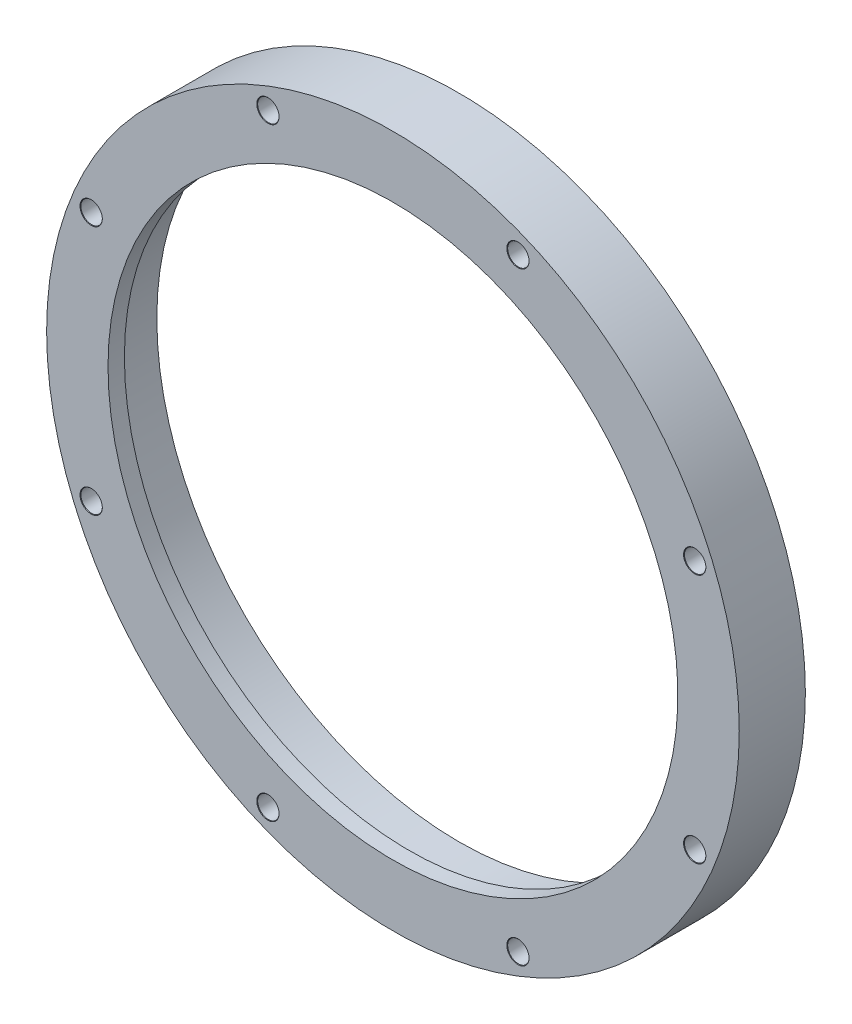
ISO-10303-21;
HEADER;
FILE_DESCRIPTION(('STEP AP214'),'2;1');
FILE_NAME('part.step','',(''),(''),'','','');
FILE_SCHEMA(('AUTOMOTIVE_DESIGN { 1 0 10303 214 1 1 1 1 }'));
ENDSEC;
DATA;
#1=APPLICATION_CONTEXT('core data for automotive mechanical design processes');
#2=APPLICATION_PROTOCOL_DEFINITION('international standard','automotive_design',2000,#1);
#3=PRODUCT_CONTEXT('',#1,'mechanical');
#4=PRODUCT('Part','Part','',(#3));
#5=PRODUCT_RELATED_PRODUCT_CATEGORY('part','',(#4));
#6=PRODUCT_DEFINITION_FORMATION('','',#4);
#7=PRODUCT_DEFINITION_CONTEXT('part definition',#1,'design');
#8=PRODUCT_DEFINITION('design','',#6,#7);
#9=PRODUCT_DEFINITION_SHAPE('','',#8);
#10=(LENGTH_UNIT() NAMED_UNIT(*) SI_UNIT(.MILLI.,.METRE.));
#11=(NAMED_UNIT(*) PLANE_ANGLE_UNIT() SI_UNIT($,.RADIAN.));
#12=(NAMED_UNIT(*) SI_UNIT($,.STERADIAN.) SOLID_ANGLE_UNIT());
#13=UNCERTAINTY_MEASURE_WITH_UNIT(LENGTH_MEASURE(1.E-05),#10,'distance_accuracy_value','');
#14=(GEOMETRIC_REPRESENTATION_CONTEXT(3) GLOBAL_UNCERTAINTY_ASSIGNED_CONTEXT((#13)) GLOBAL_UNIT_ASSIGNED_CONTEXT((#10,
#11,#12)) REPRESENTATION_CONTEXT('',''));
#15=CARTESIAN_POINT('',(0.,0.,0.));
#16=DIRECTION('',(0.,0.,1.));
#17=DIRECTION('',(1.,0.,0.));
#18=AXIS2_PLACEMENT_3D('',#15,#16,#17);
#19=CARTESIAN_POINT('',(0.,0.,70.4));
#20=DIRECTION('',(0.,0.,1.));
#21=DIRECTION('',(1.,0.,0.));
#22=AXIS2_PLACEMENT_3D('',#19,#20,#21);
#23=PLANE('',#22);
#24=CARTESIAN_POINT('',(0.,0.,70.4));
#25=DIRECTION('',(0.,0.,1.));
#26=DIRECTION('',(1.,0.,0.));
#27=AXIS2_PLACEMENT_3D('',#24,#25,#26);
#28=CIRCLE('',#27,48.);
#29=CARTESIAN_POINT('',(-48.,0.,70.4));
#30=VERTEX_POINT('',#29);
#31=EDGE_CURVE('E39',#30,#30,#28,.T.);
#32=ORIENTED_EDGE('',*,*,#31,.F.);
#33=EDGE_LOOP('',(#32));
#34=FACE_BOUND('',#33,.T.);
#35=CARTESIAN_POINT('',(0.,0.,70.4));
#36=DIRECTION('',(0.,0.,1.));
#37=DIRECTION('',(1.,0.,0.));
#38=AXIS2_PLACEMENT_3D('',#35,#36,#37);
#39=CIRCLE('',#38,45.25);
#40=CARTESIAN_POINT('',(-45.25,0.,70.4));
#41=VERTEX_POINT('',#40);
#42=EDGE_CURVE('E11',#41,#41,#39,.T.);
#43=ORIENTED_EDGE('',*,*,#42,.T.);
#44=EDGE_LOOP('',(#43));
#45=FACE_BOUND('',#44,.T.);
#46=ADVANCED_FACE('F16',(#34,#45),#23,.F.);
#47=CARTESIAN_POINT('',(19.851703053939,47.926250749023,73.0149494936612));
#48=DIRECTION('',(0.,0.,1.));
#49=DIRECTION('',(1.,0.,0.));
#50=AXIS2_PLACEMENT_3D('',#47,#48,#49);
#51=CONICAL_SURFACE('',#50,1.78505050633883,0.785398163397448);
#52=CARTESIAN_POINT('',(19.851703053939,47.926250749023,72.9298989873223));
#53=DIRECTION('',(0.,0.,-1.));
#54=DIRECTION('',(1.,0.,0.));
#55=AXIS2_PLACEMENT_3D('',#52,#53,#54);
#56=CIRCLE('',#55,1.7);
#57=CARTESIAN_POINT('',(18.151703053939,47.926250749023,72.9298989873223));
#58=VERTEX_POINT('',#57);
#59=EDGE_CURVE('E27',#58,#58,#56,.T.);
#60=ORIENTED_EDGE('',*,*,#59,.T.);
#61=DIRECTION('',(-0.707106781186547,0.,0.707106781186548));
#62=VECTOR('',#61,1.);
#63=CARTESIAN_POINT('',(18.0666525476002,47.926250749023,73.0149494936612));
#64=LINE('',#63,#62);
#65=CARTESIAN_POINT('',(18.0816020412613,47.926250749023,73.));
#66=VERTEX_POINT('',#65);
#67=EDGE_CURVE('E327',#58,#66,#64,.T.);
#68=ORIENTED_EDGE('',*,*,#67,.T.);
#69=CARTESIAN_POINT('',(19.851703053939,47.926250749023,73.));
#70=DIRECTION('',(0.,0.,-1.));
#71=DIRECTION('',(1.,0.,0.));
#72=AXIS2_PLACEMENT_3D('',#69,#70,#71);
#73=CIRCLE('',#72,1.77010101267767);
#74=CARTESIAN_POINT('',(19.1743147227746,46.2908906529326,73.));
#75=VERTEX_POINT('',#74);
#76=EDGE_CURVE('E335',#75,#66,#73,.T.);
#77=ORIENTED_EDGE('',*,*,#76,.F.);
#78=CARTESIAN_POINT('',(19.851703053939,47.926250749023,73.));
#79=DIRECTION('',(0.,0.,-1.));
#80=DIRECTION('',(1.,0.,0.));
#81=AXIS2_PLACEMENT_3D('',#78,#79,#80);
#82=CIRCLE('',#81,1.77010101267767);
#83=EDGE_CURVE('E321',#66,#75,#82,.T.);
#84=ORIENTED_EDGE('',*,*,#83,.F.);
#85=ORIENTED_EDGE('',*,*,#67,.F.);
#86=EDGE_LOOP('',(#60,#68,#77,#84,#85));
#87=FACE_BOUND('',#86,.T.);
#88=ADVANCED_FACE('F423',(#87),#51,.F.);
#89=CARTESIAN_POINT('',(-19.851703053939,47.926250749023,73.0149494936612));
#90=DIRECTION('',(0.,0.,1.));
#91=DIRECTION('',(1.,0.,0.));
#92=AXIS2_PLACEMENT_3D('',#89,#90,#91);
#93=CONICAL_SURFACE('',#92,1.78505050633883,0.785398163397448);
#94=CARTESIAN_POINT('',(-19.851703053939,47.926250749023,72.9298989873223));
#95=DIRECTION('',(0.,0.,-1.));
#96=DIRECTION('',(1.,0.,0.));
#97=AXIS2_PLACEMENT_3D('',#94,#95,#96);
#98=CIRCLE('',#97,1.7);
#99=CARTESIAN_POINT('',(-21.551703053939,47.926250749023,72.9298989873223));
#100=VERTEX_POINT('',#99);
#101=EDGE_CURVE('E231',#100,#100,#98,.T.);
#102=ORIENTED_EDGE('',*,*,#101,.T.);
#103=DIRECTION('',(-0.707106781186547,0.,0.707106781186548));
#104=VECTOR('',#103,1.);
#105=CARTESIAN_POINT('',(-21.6367535602778,47.926250749023,73.0149494936612));
#106=LINE('',#105,#104);
#107=CARTESIAN_POINT('',(-21.6218040666167,47.926250749023,73.));
#108=VERTEX_POINT('',#107);
#109=EDGE_CURVE('E227',#100,#108,#106,.T.);
#110=ORIENTED_EDGE('',*,*,#109,.T.);
#111=CARTESIAN_POINT('',(-19.851703053939,47.926250749023,73.));
#112=DIRECTION('',(0.,0.,-1.));
#113=DIRECTION('',(1.,0.,0.));
#114=AXIS2_PLACEMENT_3D('',#111,#112,#113);
#115=CIRCLE('',#114,1.77010101267767);
#116=CARTESIAN_POINT('',(-19.1743147227746,46.2908906529326,73.));
#117=VERTEX_POINT('',#116);
#118=EDGE_CURVE('E220',#117,#108,#115,.T.);
#119=ORIENTED_EDGE('',*,*,#118,.F.);
#120=CARTESIAN_POINT('',(-19.851703053939,47.926250749023,73.));
#121=DIRECTION('',(0.,0.,-1.));
#122=DIRECTION('',(1.,0.,0.));
#123=AXIS2_PLACEMENT_3D('',#120,#121,#122);
#124=CIRCLE('',#123,1.77010101267767);
#125=EDGE_CURVE('E216',#108,#117,#124,.T.);
#126=ORIENTED_EDGE('',*,*,#125,.F.);
#127=ORIENTED_EDGE('',*,*,#109,.F.);
#128=EDGE_LOOP('',(#102,#110,#119,#126,#127));
#129=FACE_BOUND('',#128,.T.);
#130=ADVANCED_FACE('F430',(#129),#93,.F.);
#131=CARTESIAN_POINT('',(-47.926250749023,19.851703053939,73.0149494936612));
#132=DIRECTION('',(0.,0.,1.));
#133=DIRECTION('',(1.,0.,0.));
#134=AXIS2_PLACEMENT_3D('',#131,#132,#133);
#135=CONICAL_SURFACE('',#134,1.78505050633883,0.785398163397448);
#136=CARTESIAN_POINT('',(-47.926250749023,19.851703053939,72.9298989873223));
#137=DIRECTION('',(0.,0.,-1.));
#138=DIRECTION('',(1.,0.,0.));
#139=AXIS2_PLACEMENT_3D('',#136,#137,#138);
#140=CIRCLE('',#139,1.7);
#141=CARTESIAN_POINT('',(-49.626250749023,19.851703053939,72.9298989873223));
#142=VERTEX_POINT('',#141);
#143=EDGE_CURVE('E232',#142,#142,#140,.T.);
#144=ORIENTED_EDGE('',*,*,#143,.T.);
#145=DIRECTION('',(-0.707106781186547,0.,0.707106781186548));
#146=VECTOR('',#145,1.);
#147=CARTESIAN_POINT('',(-49.7113012553618,19.851703053939,73.0149494936612));
#148=LINE('',#147,#146);
#149=CARTESIAN_POINT('',(-49.6963517617007,19.851703053939,73.));
#150=VERTEX_POINT('',#149);
#151=EDGE_CURVE('E20',#142,#150,#148,.T.);
#152=ORIENTED_EDGE('',*,*,#151,.T.);
#153=CARTESIAN_POINT('',(-47.926250749023,19.851703053939,73.));
#154=DIRECTION('',(0.,0.,-1.));
#155=DIRECTION('',(1.,0.,0.));
#156=AXIS2_PLACEMENT_3D('',#153,#154,#155);
#157=CIRCLE('',#156,1.77010101267767);
#158=CARTESIAN_POINT('',(-46.2908906529326,19.1743147227746,73.));
#159=VERTEX_POINT('',#158);
#160=EDGE_CURVE('E221',#159,#150,#157,.T.);
#161=ORIENTED_EDGE('',*,*,#160,.F.);
#162=CARTESIAN_POINT('',(-47.926250749023,19.851703053939,73.));
#163=DIRECTION('',(0.,0.,-1.));
#164=DIRECTION('',(1.,0.,0.));
#165=AXIS2_PLACEMENT_3D('',#162,#163,#164);
#166=CIRCLE('',#165,1.77010101267767);
#167=EDGE_CURVE('E225',#150,#159,#166,.T.);
#168=ORIENTED_EDGE('',*,*,#167,.F.);
#169=ORIENTED_EDGE('',*,*,#151,.F.);
#170=EDGE_LOOP('',(#144,#152,#161,#168,#169));
#171=FACE_BOUND('',#170,.T.);
#172=ADVANCED_FACE('F464',(#171),#135,.F.);
#173=CARTESIAN_POINT('',(-47.926250749023,-19.851703053939,73.0149494936612));
#174=DIRECTION('',(0.,0.,1.));
#175=DIRECTION('',(1.,0.,0.));
#176=AXIS2_PLACEMENT_3D('',#173,#174,#175);
#177=CONICAL_SURFACE('',#176,1.78505050633883,0.785398163397448);
#178=CARTESIAN_POINT('',(-47.926250749023,-19.851703053939,72.9298989873223));
#179=DIRECTION('',(0.,0.,-1.));
#180=DIRECTION('',(1.,0.,0.));
#181=AXIS2_PLACEMENT_3D('',#178,#179,#180);
#182=CIRCLE('',#181,1.7);
#183=CARTESIAN_POINT('',(-49.626250749023,-19.851703053939,72.9298989873223));
#184=VERTEX_POINT('',#183);
#185=EDGE_CURVE('E291',#184,#184,#182,.T.);
#186=ORIENTED_EDGE('',*,*,#185,.T.);
#187=DIRECTION('',(-0.707106781186547,0.,0.707106781186548));
#188=VECTOR('',#187,1.);
#189=CARTESIAN_POINT('',(-49.7113012553618,-19.851703053939,73.0149494936612));
#190=LINE('',#189,#188);
#191=CARTESIAN_POINT('',(-49.6963517617007,-19.851703053939,73.));
#192=VERTEX_POINT('',#191);
#193=EDGE_CURVE('E286',#184,#192,#190,.T.);
#194=ORIENTED_EDGE('',*,*,#193,.T.);
#195=CARTESIAN_POINT('',(-47.926250749023,-19.851703053939,73.));
#196=DIRECTION('',(0.,0.,-1.));
#197=DIRECTION('',(1.,0.,0.));
#198=AXIS2_PLACEMENT_3D('',#195,#196,#197);
#199=CIRCLE('',#198,1.77010101267767);
#200=CARTESIAN_POINT('',(-46.2908906529326,-19.1743147227746,73.));
#201=VERTEX_POINT('',#200);
#202=EDGE_CURVE('E222',#201,#192,#199,.T.);
#203=ORIENTED_EDGE('',*,*,#202,.F.);
#204=CARTESIAN_POINT('',(-47.926250749023,-19.851703053939,73.));
#205=DIRECTION('',(0.,0.,-1.));
#206=DIRECTION('',(1.,0.,0.));
#207=AXIS2_PLACEMENT_3D('',#204,#205,#206);
#208=CIRCLE('',#207,1.77010101267767);
#209=EDGE_CURVE('E226',#192,#201,#208,.T.);
#210=ORIENTED_EDGE('',*,*,#209,.F.);
#211=ORIENTED_EDGE('',*,*,#193,.F.);
#212=EDGE_LOOP('',(#186,#194,#203,#210,#211));
#213=FACE_BOUND('',#212,.T.);
#214=ADVANCED_FACE('F460',(#213),#177,.F.);
#215=CARTESIAN_POINT('',(-19.851703053939,-47.926250749023,73.0149494936612));
#216=DIRECTION('',(0.,0.,1.));
#217=DIRECTION('',(1.,0.,0.));
#218=AXIS2_PLACEMENT_3D('',#215,#216,#217);
#219=CONICAL_SURFACE('',#218,1.78505050633883,0.785398163397448);
#220=CARTESIAN_POINT('',(-19.851703053939,-47.926250749023,72.9298989873223));
#221=DIRECTION('',(0.,0.,-1.));
#222=DIRECTION('',(1.,0.,0.));
#223=AXIS2_PLACEMENT_3D('',#220,#221,#222);
#224=CIRCLE('',#223,1.7);
#225=CARTESIAN_POINT('',(-21.551703053939,-47.926250749023,72.9298989873223));
#226=VERTEX_POINT('',#225);
#227=EDGE_CURVE('E282',#226,#226,#224,.T.);
#228=ORIENTED_EDGE('',*,*,#227,.T.);
#229=DIRECTION('',(-0.707106781186547,0.,0.707106781186548));
#230=VECTOR('',#229,1.);
#231=CARTESIAN_POINT('',(-21.6367535602778,-47.926250749023,73.0149494936612));
#232=LINE('',#231,#230);
#233=CARTESIAN_POINT('',(-21.6218040666167,-47.926250749023,73.));
#234=VERTEX_POINT('',#233);
#235=EDGE_CURVE('E240',#226,#234,#232,.T.);
#236=ORIENTED_EDGE('',*,*,#235,.T.);
#237=CARTESIAN_POINT('',(-19.851703053939,-47.926250749023,73.));
#238=DIRECTION('',(0.,0.,-1.));
#239=DIRECTION('',(1.,0.,0.));
#240=AXIS2_PLACEMENT_3D('',#237,#238,#239);
#241=CIRCLE('',#240,1.77010101267767);
#242=CARTESIAN_POINT('',(-19.1743147227746,-46.2908906529326,73.));
#243=VERTEX_POINT('',#242);
#244=EDGE_CURVE('E148',#243,#234,#241,.T.);
#245=ORIENTED_EDGE('',*,*,#244,.F.);
#246=CARTESIAN_POINT('',(-19.851703053939,-47.926250749023,73.));
#247=DIRECTION('',(0.,0.,-1.));
#248=DIRECTION('',(1.,0.,0.));
#249=AXIS2_PLACEMENT_3D('',#246,#247,#248);
#250=CIRCLE('',#249,1.77010101267767);
#251=EDGE_CURVE('E309',#234,#243,#250,.T.);
#252=ORIENTED_EDGE('',*,*,#251,.F.);
#253=ORIENTED_EDGE('',*,*,#235,.F.);
#254=EDGE_LOOP('',(#228,#236,#245,#252,#253));
#255=FACE_BOUND('',#254,.T.);
#256=ADVANCED_FACE('F463',(#255),#219,.F.);
#257=CARTESIAN_POINT('',(19.851703053939,-47.926250749023,73.0149494936612));
#258=DIRECTION('',(0.,0.,1.));
#259=DIRECTION('',(1.,0.,0.));
#260=AXIS2_PLACEMENT_3D('',#257,#258,#259);
#261=CONICAL_SURFACE('',#260,1.78505050633883,0.785398163397448);
#262=CARTESIAN_POINT('',(19.851703053939,-47.926250749023,72.9298989873223));
#263=DIRECTION('',(0.,0.,-1.));
#264=DIRECTION('',(1.,0.,0.));
#265=AXIS2_PLACEMENT_3D('',#262,#263,#264);
#266=CIRCLE('',#265,1.7);
#267=CARTESIAN_POINT('',(18.151703053939,-47.926250749023,72.9298989873223));
#268=VERTEX_POINT('',#267);
#269=EDGE_CURVE('E237',#268,#268,#266,.T.);
#270=ORIENTED_EDGE('',*,*,#269,.T.);
#271=DIRECTION('',(-0.707106781186547,0.,0.707106781186548));
#272=VECTOR('',#271,1.);
#273=CARTESIAN_POINT('',(18.0666525476002,-47.926250749023,73.0149494936612));
#274=LINE('',#273,#272);
#275=CARTESIAN_POINT('',(18.0816020412613,-47.926250749023,73.));
#276=VERTEX_POINT('',#275);
#277=EDGE_CURVE('E161',#268,#276,#274,.T.);
#278=ORIENTED_EDGE('',*,*,#277,.T.);
#279=CARTESIAN_POINT('',(19.851703053939,-47.926250749023,73.));
#280=DIRECTION('',(0.,0.,-1.));
#281=DIRECTION('',(1.,0.,0.));
#282=AXIS2_PLACEMENT_3D('',#279,#280,#281);
#283=CIRCLE('',#282,1.77010101267767);
#284=CARTESIAN_POINT('',(19.1743147227746,-46.2908906529326,73.));
#285=VERTEX_POINT('',#284);
#286=EDGE_CURVE('E312',#285,#276,#283,.T.);
#287=ORIENTED_EDGE('',*,*,#286,.F.);
#288=CARTESIAN_POINT('',(19.851703053939,-47.926250749023,73.));
#289=DIRECTION('',(0.,0.,-1.));
#290=DIRECTION('',(1.,0.,0.));
#291=AXIS2_PLACEMENT_3D('',#288,#289,#290);
#292=CIRCLE('',#291,1.77010101267767);
#293=EDGE_CURVE('E359',#276,#285,#292,.T.);
#294=ORIENTED_EDGE('',*,*,#293,.F.);
#295=ORIENTED_EDGE('',*,*,#277,.F.);
#296=EDGE_LOOP('',(#270,#278,#287,#294,#295));
#297=FACE_BOUND('',#296,.T.);
#298=ADVANCED_FACE('F458',(#297),#261,.F.);
#299=CARTESIAN_POINT('',(47.926250749023,-19.851703053939,73.0149494936612));
#300=DIRECTION('',(0.,0.,1.));
#301=DIRECTION('',(1.,0.,0.));
#302=AXIS2_PLACEMENT_3D('',#299,#300,#301);
#303=CONICAL_SURFACE('',#302,1.78505050633883,0.785398163397448);
#304=CARTESIAN_POINT('',(47.926250749023,-19.851703053939,72.9298989873223));
#305=DIRECTION('',(0.,0.,-1.));
#306=DIRECTION('',(1.,0.,0.));
#307=AXIS2_PLACEMENT_3D('',#304,#305,#306);
#308=CIRCLE('',#307,1.7);
#309=CARTESIAN_POINT('',(46.226250749023,-19.851703053939,72.9298989873223));
#310=VERTEX_POINT('',#309);
#311=EDGE_CURVE('E339',#310,#310,#308,.T.);
#312=ORIENTED_EDGE('',*,*,#311,.T.);
#313=DIRECTION('',(-0.707106781186547,0.,0.707106781186548));
#314=VECTOR('',#313,1.);
#315=CARTESIAN_POINT('',(46.1412002426842,-19.851703053939,73.0149494936612));
#316=LINE('',#315,#314);
#317=CARTESIAN_POINT('',(46.1561497363453,-19.851703053939,73.));
#318=VERTEX_POINT('',#317);
#319=EDGE_CURVE('E343',#310,#318,#316,.T.);
#320=ORIENTED_EDGE('',*,*,#319,.T.);
#321=CARTESIAN_POINT('',(47.926250749023,-19.851703053939,73.));
#322=DIRECTION('',(0.,0.,-1.));
#323=DIRECTION('',(1.,0.,0.));
#324=AXIS2_PLACEMENT_3D('',#321,#322,#323);
#325=CIRCLE('',#324,1.77010101267767);
#326=CARTESIAN_POINT('',(46.2908906529326,-19.1743147227746,73.));
#327=VERTEX_POINT('',#326);
#328=EDGE_CURVE('E352',#327,#318,#325,.T.);
#329=ORIENTED_EDGE('',*,*,#328,.F.);
#330=CARTESIAN_POINT('',(47.926250749023,-19.851703053939,73.));
#331=DIRECTION('',(0.,0.,-1.));
#332=DIRECTION('',(1.,0.,0.));
#333=AXIS2_PLACEMENT_3D('',#330,#331,#332);
#334=CIRCLE('',#333,1.77010101267767);
#335=EDGE_CURVE('E304',#318,#327,#334,.T.);
#336=ORIENTED_EDGE('',*,*,#335,.F.);
#337=ORIENTED_EDGE('',*,*,#319,.F.);
#338=EDGE_LOOP('',(#312,#320,#329,#336,#337));
#339=FACE_BOUND('',#338,.T.);
#340=ADVANCED_FACE('F455',(#339),#303,.F.);
#341=CARTESIAN_POINT('',(0.,0.,73.));
#342=DIRECTION('',(0.,0.,1.));
#343=DIRECTION('',(1.,0.,0.));
#344=AXIS2_PLACEMENT_3D('',#341,#342,#343);
#345=PLANE('',#344);
#346=CARTESIAN_POINT('',(0.,0.,73.));
#347=DIRECTION('',(0.,0.,1.));
#348=DIRECTION('',(1.,0.,0.));
#349=AXIS2_PLACEMENT_3D('',#346,#347,#348);
#350=CIRCLE('',#349,55.);
#351=CARTESIAN_POINT('',(-55.,0.,73.));
#352=VERTEX_POINT('',#351);
#353=EDGE_CURVE('E338',#352,#352,#350,.T.);
#354=ORIENTED_EDGE('',*,*,#353,.T.);
#355=EDGE_LOOP('',(#354));
#356=FACE_BOUND('',#355,.T.);
#357=ORIENTED_EDGE('',*,*,#76,.T.);
#358=ORIENTED_EDGE('',*,*,#83,.T.);
#359=EDGE_LOOP('',(#357,#358));
#360=FACE_BOUND('',#359,.T.);
#361=ORIENTED_EDGE('',*,*,#118,.T.);
#362=ORIENTED_EDGE('',*,*,#125,.T.);
#363=EDGE_LOOP('',(#361,#362));
#364=FACE_BOUND('',#363,.T.);
#365=ORIENTED_EDGE('',*,*,#160,.T.);
#366=ORIENTED_EDGE('',*,*,#167,.T.);
#367=EDGE_LOOP('',(#365,#366));
#368=FACE_BOUND('',#367,.T.);
#369=ORIENTED_EDGE('',*,*,#202,.T.);
#370=ORIENTED_EDGE('',*,*,#209,.T.);
#371=EDGE_LOOP('',(#369,#370));
#372=FACE_BOUND('',#371,.T.);
#373=ORIENTED_EDGE('',*,*,#244,.T.);
#374=ORIENTED_EDGE('',*,*,#251,.T.);
#375=EDGE_LOOP('',(#373,#374));
#376=FACE_BOUND('',#375,.T.);
#377=ORIENTED_EDGE('',*,*,#286,.T.);
#378=ORIENTED_EDGE('',*,*,#293,.T.);
#379=EDGE_LOOP('',(#377,#378));
#380=FACE_BOUND('',#379,.T.);
#381=ORIENTED_EDGE('',*,*,#328,.T.);
#382=ORIENTED_EDGE('',*,*,#335,.T.);
#383=EDGE_LOOP('',(#381,#382));
#384=FACE_BOUND('',#383,.T.);
#385=CARTESIAN_POINT('',(0.,0.,73.));
#386=DIRECTION('',(0.,0.,-1.));
#387=DIRECTION('',(1.,0.,0.));
#388=AXIS2_PLACEMENT_3D('',#385,#386,#387);
#389=CIRCLE('',#388,45.25);
#390=CARTESIAN_POINT('',(-45.25,0.,73.));
#391=VERTEX_POINT('',#390);
#392=EDGE_CURVE('E261',#391,#391,#389,.T.);
#393=ORIENTED_EDGE('',*,*,#392,.T.);
#394=EDGE_LOOP('',(#393));
#395=FACE_BOUND('',#394,.T.);
#396=CARTESIAN_POINT('',(47.926250749023,19.851703053939,73.));
#397=DIRECTION('',(0.,0.,-1.));
#398=DIRECTION('',(1.,0.,0.));
#399=AXIS2_PLACEMENT_3D('',#396,#397,#398);
#400=CIRCLE('',#399,1.77010101267767);
#401=CARTESIAN_POINT('',(46.2908906529326,19.1743147227746,73.));
#402=VERTEX_POINT('',#401);
#403=CARTESIAN_POINT('',(46.1561497363453,19.851703053939,73.));
#404=VERTEX_POINT('',#403);
#405=EDGE_CURVE('E257',#402,#404,#400,.T.);
#406=ORIENTED_EDGE('',*,*,#405,.T.);
#407=CARTESIAN_POINT('',(47.926250749023,19.851703053939,73.));
#408=DIRECTION('',(0.,0.,-1.));
#409=DIRECTION('',(1.,0.,0.));
#410=AXIS2_PLACEMENT_3D('',#407,#408,#409);
#411=CIRCLE('',#410,1.77010101267767);
#412=EDGE_CURVE('E262',#404,#402,#411,.T.);
#413=ORIENTED_EDGE('',*,*,#412,.T.);
#414=EDGE_LOOP('',(#406,#413));
#415=FACE_BOUND('',#414,.T.);
#416=ADVANCED_FACE('F453',(#356,#360,#364,#368,#372,#376,#380,#384,#395,#415),#345,.T.);
#417=CARTESIAN_POINT('',(-19.851703053939,47.926250749023,53.));
#418=DIRECTION('',(0.,0.,-1.));
#419=DIRECTION('',(1.,0.,0.));
#420=AXIS2_PLACEMENT_3D('',#417,#418,#419);
#421=CYLINDRICAL_SURFACE('',#420,1.7);
#422=ORIENTED_EDGE('',*,*,#101,.F.);
#423=DIRECTION('',(0.,0.,-1.));
#424=VECTOR('',#423,1.);
#425=CARTESIAN_POINT('',(-21.551703053939,47.926250749023,53.));
#426=LINE('',#425,#424);
#427=CARTESIAN_POINT('',(-21.551703053939,47.926250749023,62.5));
#428=VERTEX_POINT('',#427);
#429=EDGE_CURVE('E331',#100,#428,#426,.T.);
#430=ORIENTED_EDGE('',*,*,#429,.T.);
#431=CARTESIAN_POINT('',(-19.851703053939,47.926250749023,62.5));
#432=DIRECTION('',(0.,0.,1.));
#433=DIRECTION('',(1.,0.,0.));
#434=AXIS2_PLACEMENT_3D('',#431,#432,#433);
#435=CIRCLE('',#434,1.7);
#436=EDGE_CURVE('E207',#428,#428,#435,.T.);
#437=ORIENTED_EDGE('',*,*,#436,.F.);
#438=ORIENTED_EDGE('',*,*,#429,.F.);
#439=EDGE_LOOP('',(#422,#430,#437,#438));
#440=FACE_BOUND('',#439,.T.);
#441=ADVANCED_FACE('F450',(#440),#421,.F.);
#442=CARTESIAN_POINT('',(-47.926250749023,-19.851703053939,53.));
#443=DIRECTION('',(0.,0.,-1.));
#444=DIRECTION('',(1.,0.,0.));
#445=AXIS2_PLACEMENT_3D('',#442,#443,#444);
#446=CYLINDRICAL_SURFACE('',#445,1.7);
#447=ORIENTED_EDGE('',*,*,#185,.F.);
#448=DIRECTION('',(0.,0.,-1.));
#449=VECTOR('',#448,1.);
#450=CARTESIAN_POINT('',(-49.626250749023,-19.851703053939,53.));
#451=LINE('',#450,#449);
#452=CARTESIAN_POINT('',(-49.626250749023,-19.851703053939,62.5));
#453=VERTEX_POINT('',#452);
#454=EDGE_CURVE('E268',#184,#453,#451,.T.);
#455=ORIENTED_EDGE('',*,*,#454,.T.);
#456=CARTESIAN_POINT('',(-47.926250749023,-19.851703053939,62.5));
#457=DIRECTION('',(0.,0.,1.));
#458=DIRECTION('',(1.,0.,0.));
#459=AXIS2_PLACEMENT_3D('',#456,#457,#458);
#460=CIRCLE('',#459,1.7);
#461=EDGE_CURVE('E198',#453,#453,#460,.T.);
#462=ORIENTED_EDGE('',*,*,#461,.F.);
#463=ORIENTED_EDGE('',*,*,#454,.F.);
#464=EDGE_LOOP('',(#447,#455,#462,#463));
#465=FACE_BOUND('',#464,.T.);
#466=ADVANCED_FACE('F447',(#465),#446,.F.);
#467=CARTESIAN_POINT('',(19.851703053939,-47.926250749023,53.));
#468=DIRECTION('',(0.,0.,-1.));
#469=DIRECTION('',(1.,0.,0.));
#470=AXIS2_PLACEMENT_3D('',#467,#468,#469);
#471=CYLINDRICAL_SURFACE('',#470,1.7);
#472=ORIENTED_EDGE('',*,*,#269,.F.);
#473=DIRECTION('',(0.,0.,-1.));
#474=VECTOR('',#473,1.);
#475=CARTESIAN_POINT('',(18.151703053939,-47.926250749023,53.));
#476=LINE('',#475,#474);
#477=CARTESIAN_POINT('',(18.151703053939,-47.926250749023,62.5));
#478=VERTEX_POINT('',#477);
#479=EDGE_CURVE('E195',#268,#478,#476,.T.);
#480=ORIENTED_EDGE('',*,*,#479,.T.);
#481=CARTESIAN_POINT('',(19.851703053939,-47.926250749023,62.5));
#482=DIRECTION('',(0.,0.,1.));
#483=DIRECTION('',(1.,0.,0.));
#484=AXIS2_PLACEMENT_3D('',#481,#482,#483);
#485=CIRCLE('',#484,1.7);
#486=EDGE_CURVE('E193',#478,#478,#485,.T.);
#487=ORIENTED_EDGE('',*,*,#486,.F.);
#488=ORIENTED_EDGE('',*,*,#479,.F.);
#489=EDGE_LOOP('',(#472,#480,#487,#488));
#490=FACE_BOUND('',#489,.T.);
#491=ADVANCED_FACE('F194',(#490),#471,.F.);
#492=CARTESIAN_POINT('',(47.926250749023,19.851703053939,73.0149494936612));
#493=DIRECTION('',(0.,0.,1.));
#494=DIRECTION('',(1.,0.,0.));
#495=AXIS2_PLACEMENT_3D('',#492,#493,#494);
#496=CONICAL_SURFACE('',#495,1.78505050633883,0.785398163397448);
#497=CARTESIAN_POINT('',(47.926250749023,19.851703053939,72.9298989873223));
#498=DIRECTION('',(0.,0.,-1.));
#499=DIRECTION('',(1.,0.,0.));
#500=AXIS2_PLACEMENT_3D('',#497,#498,#499);
#501=CIRCLE('',#500,1.7);
#502=CARTESIAN_POINT('',(46.226250749023,19.851703053939,72.9298989873223));
#503=VERTEX_POINT('',#502);
#504=EDGE_CURVE('E269',#503,#503,#501,.T.);
#505=ORIENTED_EDGE('',*,*,#504,.T.);
#506=DIRECTION('',(-0.707106781186547,0.,0.707106781186548));
#507=VECTOR('',#506,1.);
#508=CARTESIAN_POINT('',(46.1412002426842,19.851703053939,73.0149494936612));
#509=LINE('',#508,#507);
#510=EDGE_CURVE('E214',#503,#404,#509,.T.);
#511=ORIENTED_EDGE('',*,*,#510,.T.);
#512=ORIENTED_EDGE('',*,*,#405,.F.);
#513=ORIENTED_EDGE('',*,*,#412,.F.);
#514=ORIENTED_EDGE('',*,*,#510,.F.);
#515=EDGE_LOOP('',(#505,#511,#512,#513,#514));
#516=FACE_BOUND('',#515,.T.);
#517=ADVANCED_FACE('F438',(#516),#496,.F.);
#518=CARTESIAN_POINT('',(47.926250749023,19.851703053939,53.));
#519=DIRECTION('',(0.,0.,-1.));
#520=DIRECTION('',(1.,0.,0.));
#521=AXIS2_PLACEMENT_3D('',#518,#519,#520);
#522=CYLINDRICAL_SURFACE('',#521,1.7);
#523=ORIENTED_EDGE('',*,*,#504,.F.);
#524=DIRECTION('',(0.,0.,-1.));
#525=VECTOR('',#524,1.);
#526=CARTESIAN_POINT('',(46.226250749023,19.851703053939,53.));
#527=LINE('',#526,#525);
#528=CARTESIAN_POINT('',(46.226250749023,19.851703053939,62.5));
#529=VERTEX_POINT('',#528);
#530=EDGE_CURVE('E252',#503,#529,#527,.T.);
#531=ORIENTED_EDGE('',*,*,#530,.T.);
#532=CARTESIAN_POINT('',(47.926250749023,19.851703053939,62.5));
#533=DIRECTION('',(0.,0.,1.));
#534=DIRECTION('',(1.,0.,0.));
#535=AXIS2_PLACEMENT_3D('',#532,#533,#534);
#536=CIRCLE('',#535,1.7);
#537=EDGE_CURVE('E199',#529,#529,#536,.T.);
#538=ORIENTED_EDGE('',*,*,#537,.F.);
#539=ORIENTED_EDGE('',*,*,#530,.F.);
#540=EDGE_LOOP('',(#523,#531,#538,#539));
#541=FACE_BOUND('',#540,.T.);
#542=ADVANCED_FACE('F435',(#541),#522,.F.);
#543=CARTESIAN_POINT('',(47.926250749023,-19.851703053939,53.));
#544=DIRECTION('',(0.,0.,-1.));
#545=DIRECTION('',(1.,0.,0.));
#546=AXIS2_PLACEMENT_3D('',#543,#544,#545);
#547=CYLINDRICAL_SURFACE('',#546,1.7);
#548=ORIENTED_EDGE('',*,*,#311,.F.);
#549=DIRECTION('',(0.,0.,-1.));
#550=VECTOR('',#549,1.);
#551=CARTESIAN_POINT('',(46.226250749023,-19.851703053939,53.));
#552=LINE('',#551,#550);
#553=CARTESIAN_POINT('',(46.226250749023,-19.851703053939,62.5));
#554=VERTEX_POINT('',#553);
#555=EDGE_CURVE('E256',#310,#554,#552,.T.);
#556=ORIENTED_EDGE('',*,*,#555,.T.);
#557=CARTESIAN_POINT('',(47.926250749023,-19.851703053939,62.5));
#558=DIRECTION('',(0.,0.,1.));
#559=DIRECTION('',(1.,0.,0.));
#560=AXIS2_PLACEMENT_3D('',#557,#558,#559);
#561=CIRCLE('',#560,1.7);
#562=EDGE_CURVE('E210',#554,#554,#561,.T.);
#563=ORIENTED_EDGE('',*,*,#562,.F.);
#564=ORIENTED_EDGE('',*,*,#555,.F.);
#565=EDGE_LOOP('',(#548,#556,#563,#564));
#566=FACE_BOUND('',#565,.T.);
#567=ADVANCED_FACE('F383',(#566),#547,.F.);
#568=CARTESIAN_POINT('',(-19.851703053939,-47.926250749023,53.));
#569=DIRECTION('',(0.,0.,-1.));
#570=DIRECTION('',(1.,0.,0.));
#571=AXIS2_PLACEMENT_3D('',#568,#569,#570);
#572=CYLINDRICAL_SURFACE('',#571,1.7);
#573=ORIENTED_EDGE('',*,*,#227,.F.);
#574=DIRECTION('',(0.,0.,-1.));
#575=VECTOR('',#574,1.);
#576=CARTESIAN_POINT('',(-21.551703053939,-47.926250749023,53.));
#577=LINE('',#576,#575);
#578=CARTESIAN_POINT('',(-21.551703053939,-47.926250749023,62.5));
#579=VERTEX_POINT('',#578);
#580=EDGE_CURVE('E305',#226,#579,#577,.T.);
#581=ORIENTED_EDGE('',*,*,#580,.T.);
#582=CARTESIAN_POINT('',(-19.851703053939,-47.926250749023,62.5));
#583=DIRECTION('',(0.,0.,1.));
#584=DIRECTION('',(1.,0.,0.));
#585=AXIS2_PLACEMENT_3D('',#582,#583,#584);
#586=CIRCLE('',#585,1.7);
#587=EDGE_CURVE('E270',#579,#579,#586,.T.);
#588=ORIENTED_EDGE('',*,*,#587,.F.);
#589=ORIENTED_EDGE('',*,*,#580,.F.);
#590=EDGE_LOOP('',(#573,#581,#588,#589));
#591=FACE_BOUND('',#590,.T.);
#592=ADVANCED_FACE('F469',(#591),#572,.F.);
#593=CARTESIAN_POINT('',(-47.926250749023,19.851703053939,53.));
#594=DIRECTION('',(0.,0.,-1.));
#595=DIRECTION('',(1.,0.,0.));
#596=AXIS2_PLACEMENT_3D('',#593,#594,#595);
#597=CYLINDRICAL_SURFACE('',#596,1.7);
#598=ORIENTED_EDGE('',*,*,#143,.F.);
#599=DIRECTION('',(0.,0.,-1.));
#600=VECTOR('',#599,1.);
#601=CARTESIAN_POINT('',(-49.626250749023,19.851703053939,53.));
#602=LINE('',#601,#600);
#603=CARTESIAN_POINT('',(-49.626250749023,19.851703053939,62.5));
#604=VERTEX_POINT('',#603);
#605=EDGE_CURVE('E245',#142,#604,#602,.T.);
#606=ORIENTED_EDGE('',*,*,#605,.T.);
#607=CARTESIAN_POINT('',(-47.926250749023,19.851703053939,62.5));
#608=DIRECTION('',(0.,0.,1.));
#609=DIRECTION('',(1.,0.,0.));
#610=AXIS2_PLACEMENT_3D('',#607,#608,#609);
#611=CIRCLE('',#610,1.7);
#612=EDGE_CURVE('E274',#604,#604,#611,.T.);
#613=ORIENTED_EDGE('',*,*,#612,.F.);
#614=ORIENTED_EDGE('',*,*,#605,.F.);
#615=EDGE_LOOP('',(#598,#606,#613,#614));
#616=FACE_BOUND('',#615,.T.);
#617=ADVANCED_FACE('F443',(#616),#597,.F.);
#618=CARTESIAN_POINT('',(19.851703053939,47.926250749023,53.));
#619=DIRECTION('',(0.,0.,-1.));
#620=DIRECTION('',(1.,0.,0.));
#621=AXIS2_PLACEMENT_3D('',#618,#619,#620);
#622=CYLINDRICAL_SURFACE('',#621,1.7);
#623=ORIENTED_EDGE('',*,*,#59,.F.);
#624=DIRECTION('',(0.,0.,-1.));
#625=VECTOR('',#624,1.);
#626=CARTESIAN_POINT('',(18.151703053939,47.926250749023,53.));
#627=LINE('',#626,#625);
#628=CARTESIAN_POINT('',(18.151703053939,47.926250749023,62.5));
#629=VERTEX_POINT('',#628);
#630=EDGE_CURVE('E241',#58,#629,#627,.T.);
#631=ORIENTED_EDGE('',*,*,#630,.T.);
#632=CARTESIAN_POINT('',(19.851703053939,47.926250749023,62.5));
#633=DIRECTION('',(0.,0.,1.));
#634=DIRECTION('',(1.,0.,0.));
#635=AXIS2_PLACEMENT_3D('',#632,#633,#634);
#636=CIRCLE('',#635,1.7);
#637=EDGE_CURVE('E287',#629,#629,#636,.T.);
#638=ORIENTED_EDGE('',*,*,#637,.F.);
#639=ORIENTED_EDGE('',*,*,#630,.F.);
#640=EDGE_LOOP('',(#623,#631,#638,#639));
#641=FACE_BOUND('',#640,.T.);
#642=ADVANCED_FACE('F440',(#641),#622,.F.);
#643=CARTESIAN_POINT('',(0.,0.,70.5));
#644=DIRECTION('',(0.,0.,1.));
#645=DIRECTION('',(1.,0.,0.));
#646=AXIS2_PLACEMENT_3D('',#643,#644,#645);
#647=CYLINDRICAL_SURFACE('',#646,45.25);
#648=ORIENTED_EDGE('',*,*,#42,.F.);
#649=DIRECTION('',(0.,0.,1.));
#650=VECTOR('',#649,1.);
#651=CARTESIAN_POINT('',(-45.25,0.,70.5));
#652=LINE('',#651,#650);
#653=EDGE_CURVE('E246',#41,#391,#652,.T.);
#654=ORIENTED_EDGE('',*,*,#653,.T.);
#655=ORIENTED_EDGE('',*,*,#392,.F.);
#656=ORIENTED_EDGE('',*,*,#653,.F.);
#657=EDGE_LOOP('',(#648,#654,#655,#656));
#658=FACE_BOUND('',#657,.T.);
#659=ADVANCED_FACE('F420',(#658),#647,.F.);
#660=CARTESIAN_POINT('',(0.,0.,62.5));
#661=DIRECTION('',(0.,0.,1.));
#662=DIRECTION('',(1.,0.,0.));
#663=AXIS2_PLACEMENT_3D('',#660,#661,#662);
#664=CYLINDRICAL_SURFACE('',#663,48.);
#665=CARTESIAN_POINT('',(0.,0.,62.5));
#666=DIRECTION('',(0.,0.,-1.));
#667=DIRECTION('',(1.,0.,0.));
#668=AXIS2_PLACEMENT_3D('',#665,#666,#667);
#669=CIRCLE('',#668,48.);
#670=CARTESIAN_POINT('',(-48.,0.,62.5));
#671=VERTEX_POINT('',#670);
#672=EDGE_CURVE('E247',#671,#671,#669,.T.);
#673=ORIENTED_EDGE('',*,*,#672,.T.);
#674=DIRECTION('',(0.,0.,1.));
#675=VECTOR('',#674,1.);
#676=CARTESIAN_POINT('',(-48.,0.,62.5));
#677=LINE('',#676,#675);
#678=EDGE_CURVE('E251',#671,#30,#677,.T.);
#679=ORIENTED_EDGE('',*,*,#678,.T.);
#680=ORIENTED_EDGE('',*,*,#31,.T.);
#681=ORIENTED_EDGE('',*,*,#678,.F.);
#682=EDGE_LOOP('',(#673,#679,#680,#681));
#683=FACE_BOUND('',#682,.T.);
#684=ADVANCED_FACE('F18',(#683),#664,.F.);
#685=CARTESIAN_POINT('',(0.,0.,62.5));
#686=DIRECTION('',(0.,0.,1.));
#687=DIRECTION('',(1.,0.,0.));
#688=AXIS2_PLACEMENT_3D('',#685,#686,#687);
#689=CYLINDRICAL_SURFACE('',#688,55.);
#690=ORIENTED_EDGE('',*,*,#353,.F.);
#691=DIRECTION('',(0.,0.,-1.));
#692=VECTOR('',#691,1.);
#693=CARTESIAN_POINT('',(-55.,0.,62.5));
#694=LINE('',#693,#692);
#695=CARTESIAN_POINT('',(-55.,0.,62.5));
#696=VERTEX_POINT('',#695);
#697=EDGE_CURVE('E275',#352,#696,#694,.T.);
#698=ORIENTED_EDGE('',*,*,#697,.T.);
#699=CARTESIAN_POINT('',(0.,0.,62.5));
#700=DIRECTION('',(0.,0.,1.));
#701=DIRECTION('',(1.,0.,0.));
#702=AXIS2_PLACEMENT_3D('',#699,#700,#701);
#703=CIRCLE('',#702,55.);
#704=EDGE_CURVE('E236',#696,#696,#703,.T.);
#705=ORIENTED_EDGE('',*,*,#704,.T.);
#706=ORIENTED_EDGE('',*,*,#697,.F.);
#707=EDGE_LOOP('',(#690,#698,#705,#706));
#708=FACE_BOUND('',#707,.T.);
#709=ADVANCED_FACE('F388',(#708),#689,.T.);
#710=CARTESIAN_POINT('',(0.,0.,62.5));
#711=DIRECTION('',(0.,0.,1.));
#712=DIRECTION('',(1.,0.,0.));
#713=AXIS2_PLACEMENT_3D('',#710,#711,#712);
#714=PLANE('',#713);
#715=ORIENTED_EDGE('',*,*,#704,.F.);
#716=EDGE_LOOP('',(#715));
#717=FACE_BOUND('',#716,.T.);
#718=ORIENTED_EDGE('',*,*,#436,.T.);
#719=EDGE_LOOP('',(#718));
#720=FACE_BOUND('',#719,.T.);
#721=ORIENTED_EDGE('',*,*,#461,.T.);
#722=EDGE_LOOP('',(#721));
#723=FACE_BOUND('',#722,.T.);
#724=ORIENTED_EDGE('',*,*,#486,.T.);
#725=EDGE_LOOP('',(#724));
#726=FACE_BOUND('',#725,.T.);
#727=ORIENTED_EDGE('',*,*,#537,.T.);
#728=EDGE_LOOP('',(#727));
#729=FACE_BOUND('',#728,.T.);
#730=ORIENTED_EDGE('',*,*,#562,.T.);
#731=EDGE_LOOP('',(#730));
#732=FACE_BOUND('',#731,.T.);
#733=ORIENTED_EDGE('',*,*,#587,.T.);
#734=EDGE_LOOP('',(#733));
#735=FACE_BOUND('',#734,.T.);
#736=ORIENTED_EDGE('',*,*,#612,.T.);
#737=EDGE_LOOP('',(#736));
#738=FACE_BOUND('',#737,.T.);
#739=ORIENTED_EDGE('',*,*,#637,.T.);
#740=EDGE_LOOP('',(#739));
#741=FACE_BOUND('',#740,.T.);
#742=ORIENTED_EDGE('',*,*,#672,.F.);
#743=EDGE_LOOP('',(#742));
#744=FACE_BOUND('',#743,.T.);
#745=ADVANCED_FACE('F385',(#717,#720,#723,#726,#729,#732,#735,#738,#741,#744),#714,.F.);
#746=CLOSED_SHELL('',(#46,#88,#130,#172,#214,#256,#298,#340,#416,#441,#466,#491,#517,#542,#567,
#592,#617,#642,#659,#684,#709,#745));
#747=MANIFOLD_SOLID_BREP('B1',#746);
#748=ADVANCED_BREP_SHAPE_REPRESENTATION('',(#18,#747),#14);
#749=SHAPE_DEFINITION_REPRESENTATION(#9,#748);
ENDSEC;
END-ISO-10303-21;
